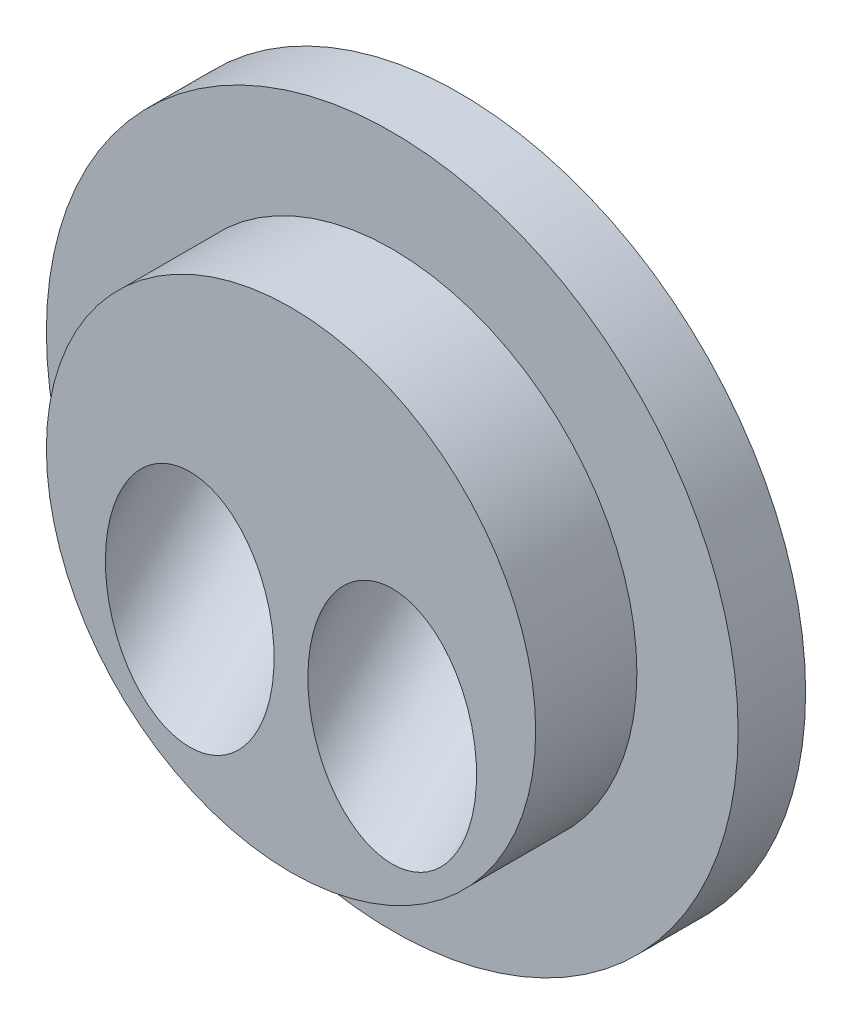
ISO-10303-21;
HEADER;
FILE_DESCRIPTION(('STEP AP214'),'2;1');
FILE_NAME('part.step','',(''),(''),'','','');
FILE_SCHEMA(('AUTOMOTIVE_DESIGN { 1 0 10303 214 1 1 1 1 }'));
ENDSEC;
DATA;
#1=APPLICATION_CONTEXT('core data for automotive mechanical design processes');
#2=APPLICATION_PROTOCOL_DEFINITION('international standard','automotive_design',2000,#1);
#3=PRODUCT_CONTEXT('',#1,'mechanical');
#4=PRODUCT('Part','Part','',(#3));
#5=PRODUCT_RELATED_PRODUCT_CATEGORY('part','',(#4));
#6=PRODUCT_DEFINITION_FORMATION('','',#4);
#7=PRODUCT_DEFINITION_CONTEXT('part definition',#1,'design');
#8=PRODUCT_DEFINITION('design','',#6,#7);
#9=PRODUCT_DEFINITION_SHAPE('','',#8);
#10=(LENGTH_UNIT() NAMED_UNIT(*) SI_UNIT(.MILLI.,.METRE.));
#11=(NAMED_UNIT(*) PLANE_ANGLE_UNIT() SI_UNIT($,.RADIAN.));
#12=(NAMED_UNIT(*) SI_UNIT($,.STERADIAN.) SOLID_ANGLE_UNIT());
#13=UNCERTAINTY_MEASURE_WITH_UNIT(LENGTH_MEASURE(1.E-05),#10,'distance_accuracy_value','');
#14=(GEOMETRIC_REPRESENTATION_CONTEXT(3) GLOBAL_UNCERTAINTY_ASSIGNED_CONTEXT((#13)) GLOBAL_UNIT_ASSIGNED_CONTEXT((#10,
#11,#12)) REPRESENTATION_CONTEXT('',''));
#15=CARTESIAN_POINT('',(0.,0.,0.));
#16=DIRECTION('',(0.,0.,1.));
#17=DIRECTION('',(1.,0.,0.));
#18=AXIS2_PLACEMENT_3D('',#15,#16,#17);
#19=CARTESIAN_POINT('',(0.,0.,2.));
#20=DIRECTION('',(0.,0.,-1.));
#21=DIRECTION('',(-1.,0.,0.));
#22=AXIS2_PLACEMENT_3D('',#19,#20,#21);
#23=CYLINDRICAL_SURFACE('',#22,10.25);
#24=CARTESIAN_POINT('',(0.,0.,2.));
#25=DIRECTION('',(0.,0.,1.));
#26=DIRECTION('',(1.,0.,0.));
#27=AXIS2_PLACEMENT_3D('',#24,#25,#26);
#28=CIRCLE('',#27,10.25);
#29=CARTESIAN_POINT('',(10.25,0.,2.));
#30=VERTEX_POINT('',#29);
#31=EDGE_CURVE('E42',#30,#30,#28,.T.);
#32=ORIENTED_EDGE('',*,*,#31,.F.);
#33=EDGE_LOOP('',(#32));
#34=FACE_BOUND('',#33,.T.);
#35=CARTESIAN_POINT('',(0.,0.,0.));
#36=DIRECTION('',(0.,0.,1.));
#37=DIRECTION('',(1.,0.,0.));
#38=AXIS2_PLACEMENT_3D('',#35,#36,#37);
#39=CIRCLE('',#38,10.25);
#40=CARTESIAN_POINT('',(10.25,0.,0.));
#41=VERTEX_POINT('',#40);
#42=EDGE_CURVE('E47',#41,#41,#39,.T.);
#43=ORIENTED_EDGE('',*,*,#42,.T.);
#44=EDGE_LOOP('',(#43));
#45=FACE_BOUND('',#44,.T.);
#46=ADVANCED_FACE('F35',(#34,#45),#23,.T.);
#47=CARTESIAN_POINT('',(0.,0.,2.));
#48=DIRECTION('',(0.,0.,1.));
#49=DIRECTION('',(1.,0.,0.));
#50=AXIS2_PLACEMENT_3D('',#47,#48,#49);
#51=PLANE('',#50);
#52=CARTESIAN_POINT('',(0.,0.,2.));
#53=DIRECTION('',(0.,0.,1.));
#54=DIRECTION('',(1.,0.,0.));
#55=AXIS2_PLACEMENT_3D('',#52,#53,#54);
#56=CIRCLE('',#55,7.25);
#57=CARTESIAN_POINT('',(7.25,0.,2.));
#58=VERTEX_POINT('',#57);
#59=EDGE_CURVE('E10',#58,#58,#56,.T.);
#60=ORIENTED_EDGE('',*,*,#59,.F.);
#61=EDGE_LOOP('',(#60));
#62=FACE_BOUND('',#61,.T.);
#63=ORIENTED_EDGE('',*,*,#31,.T.);
#64=EDGE_LOOP('',(#63));
#65=FACE_BOUND('',#64,.T.);
#66=ADVANCED_FACE('F84',(#62,#65),#51,.T.);
#67=CARTESIAN_POINT('',(0.,0.,0.));
#68=DIRECTION('',(0.,0.,1.));
#69=DIRECTION('',(1.,0.,0.));
#70=AXIS2_PLACEMENT_3D('',#67,#68,#69);
#71=PLANE('',#70);
#72=CARTESIAN_POINT('',(-3.,3.,0.));
#73=DIRECTION('',(0.,0.,1.));
#74=DIRECTION('',(0.,-1.,0.));
#75=AXIS2_PLACEMENT_3D('',#72,#73,#74);
#76=ELLIPSE('',#75,3.53553390593274,2.5);
#77=CARTESIAN_POINT('',(-3.,-0.53553390593274,0.));
#78=VERTEX_POINT('',#77);
#79=EDGE_CURVE('E64',#78,#78,#76,.T.);
#80=ORIENTED_EDGE('',*,*,#79,.T.);
#81=EDGE_LOOP('',(#80));
#82=FACE_BOUND('',#81,.T.);
#83=CARTESIAN_POINT('',(3.,3.,0.));
#84=DIRECTION('',(0.,0.,1.));
#85=DIRECTION('',(0.,-1.,0.));
#86=AXIS2_PLACEMENT_3D('',#83,#84,#85);
#87=ELLIPSE('',#86,3.53553390593274,2.5);
#88=CARTESIAN_POINT('',(3.,-0.53553390593274,0.));
#89=VERTEX_POINT('',#88);
#90=EDGE_CURVE('E56',#89,#89,#87,.T.);
#91=ORIENTED_EDGE('',*,*,#90,.T.);
#92=EDGE_LOOP('',(#91));
#93=FACE_BOUND('',#92,.T.);
#94=ORIENTED_EDGE('',*,*,#42,.F.);
#95=EDGE_LOOP('',(#94));
#96=FACE_BOUND('',#95,.T.);
#97=ADVANCED_FACE('F75',(#82,#93,#96),#71,.F.);
#98=CARTESIAN_POINT('',(0.,0.,5.));
#99=DIRECTION('',(0.,0.,-1.));
#100=DIRECTION('',(-1.,0.,0.));
#101=AXIS2_PLACEMENT_3D('',#98,#99,#100);
#102=CYLINDRICAL_SURFACE('',#101,7.25);
#103=CARTESIAN_POINT('',(0.,0.,5.));
#104=DIRECTION('',(0.,0.,1.));
#105=DIRECTION('',(1.,0.,0.));
#106=AXIS2_PLACEMENT_3D('',#103,#104,#105);
#107=CIRCLE('',#106,7.25);
#108=CARTESIAN_POINT('',(7.25,0.,5.));
#109=VERTEX_POINT('',#108);
#110=EDGE_CURVE('E50',#109,#109,#107,.T.);
#111=ORIENTED_EDGE('',*,*,#110,.F.);
#112=EDGE_LOOP('',(#111));
#113=FACE_BOUND('',#112,.T.);
#114=ORIENTED_EDGE('',*,*,#59,.T.);
#115=EDGE_LOOP('',(#114));
#116=FACE_BOUND('',#115,.T.);
#117=ADVANCED_FACE('F73',(#113,#116),#102,.T.);
#118=CARTESIAN_POINT('',(0.,0.,5.));
#119=DIRECTION('',(0.,0.,1.));
#120=DIRECTION('',(1.,0.,0.));
#121=AXIS2_PLACEMENT_3D('',#118,#119,#120);
#122=PLANE('',#121);
#123=CARTESIAN_POINT('',(-3.,-2.,5.));
#124=DIRECTION('',(0.,0.,1.));
#125=DIRECTION('',(0.,-1.,0.));
#126=AXIS2_PLACEMENT_3D('',#123,#124,#125);
#127=ELLIPSE('',#126,3.53553390593274,2.5);
#128=CARTESIAN_POINT('',(-3.,-5.53553390593274,5.));
#129=VERTEX_POINT('',#128);
#130=EDGE_CURVE('E38',#129,#129,#127,.T.);
#131=ORIENTED_EDGE('',*,*,#130,.F.);
#132=EDGE_LOOP('',(#131));
#133=FACE_BOUND('',#132,.T.);
#134=CARTESIAN_POINT('',(3.,-2.,5.));
#135=DIRECTION('',(0.,0.,1.));
#136=DIRECTION('',(0.,-1.,0.));
#137=AXIS2_PLACEMENT_3D('',#134,#135,#136);
#138=ELLIPSE('',#137,3.53553390593274,2.5);
#139=CARTESIAN_POINT('',(3.,-5.53553390593274,5.));
#140=VERTEX_POINT('',#139);
#141=EDGE_CURVE('E54',#140,#140,#138,.T.);
#142=ORIENTED_EDGE('',*,*,#141,.F.);
#143=EDGE_LOOP('',(#142));
#144=FACE_BOUND('',#143,.T.);
#145=ORIENTED_EDGE('',*,*,#110,.T.);
#146=EDGE_LOOP('',(#145));
#147=FACE_BOUND('',#146,.T.);
#148=ADVANCED_FACE('F71',(#133,#144,#147),#122,.T.);
#149=CARTESIAN_POINT('',(3.,6.625,-3.625));
#150=DIRECTION('',(0.,-0.707106781186548,0.707106781186548));
#151=DIRECTION('',(0.,-0.707106781186548,-0.707106781186548));
#152=AXIS2_PLACEMENT_3D('',#149,#150,#151);
#153=CYLINDRICAL_SURFACE('',#152,2.5);
#154=ORIENTED_EDGE('',*,*,#141,.T.);
#155=EDGE_LOOP('',(#154));
#156=FACE_BOUND('',#155,.T.);
#157=ORIENTED_EDGE('',*,*,#90,.F.);
#158=EDGE_LOOP('',(#157));
#159=FACE_BOUND('',#158,.T.);
#160=ADVANCED_FACE('F81',(#156,#159),#153,.F.);
#161=CARTESIAN_POINT('',(-3.,6.625,-3.625));
#162=DIRECTION('',(0.,-0.707106781186548,0.707106781186548));
#163=DIRECTION('',(0.,-0.707106781186548,-0.707106781186548));
#164=AXIS2_PLACEMENT_3D('',#161,#162,#163);
#165=CYLINDRICAL_SURFACE('',#164,2.5);
#166=ORIENTED_EDGE('',*,*,#130,.T.);
#167=EDGE_LOOP('',(#166));
#168=FACE_BOUND('',#167,.T.);
#169=ORIENTED_EDGE('',*,*,#79,.F.);
#170=EDGE_LOOP('',(#169));
#171=FACE_BOUND('',#170,.T.);
#172=ADVANCED_FACE('F122',(#168,#171),#165,.F.);
#173=CLOSED_SHELL('',(#46,#66,#97,#117,#148,#160,#172));
#174=MANIFOLD_SOLID_BREP('B2',#173);
#175=ADVANCED_BREP_SHAPE_REPRESENTATION('',(#18,#174),#14);
#176=SHAPE_DEFINITION_REPRESENTATION(#9,#175);
ENDSEC;
END-ISO-10303-21;
